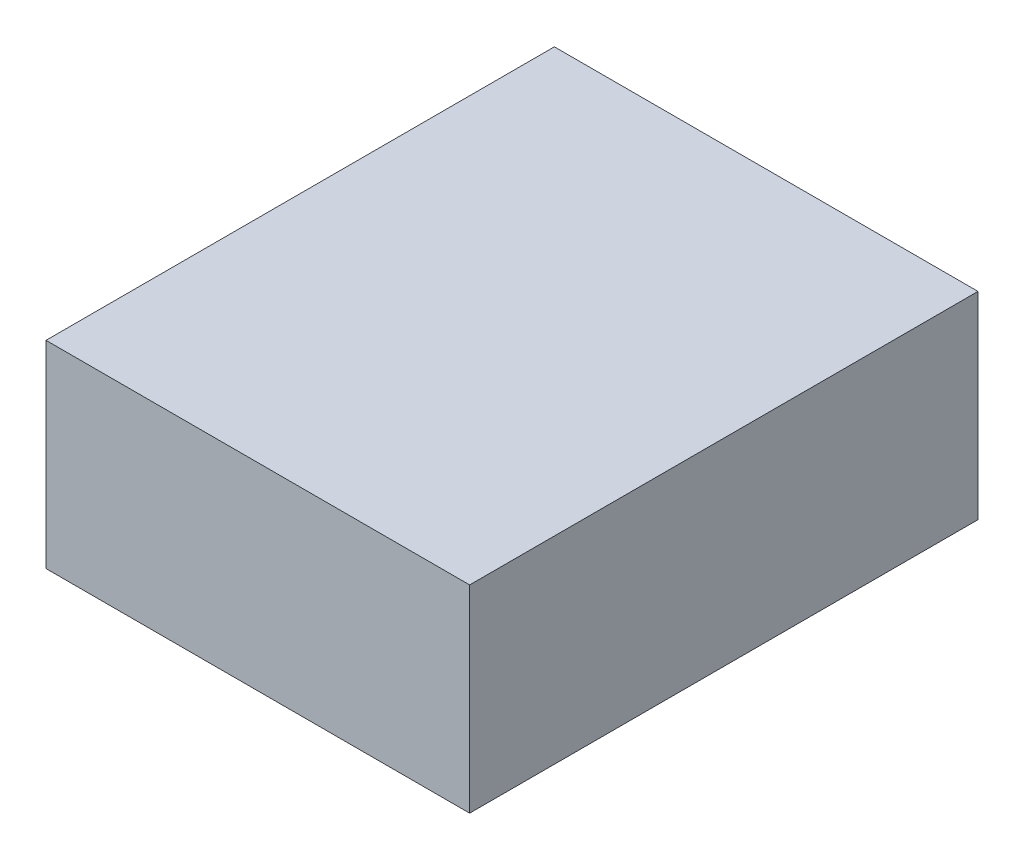
ISO-10303-21;
HEADER;
FILE_DESCRIPTION(('STEP AP214'),'2;1');
FILE_NAME('part.step','',(''),(''),'','','');
FILE_SCHEMA(('AUTOMOTIVE_DESIGN { 1 0 10303 214 1 1 1 1 }'));
ENDSEC;
DATA;
#1=APPLICATION_CONTEXT('core data for automotive mechanical design processes');
#2=APPLICATION_PROTOCOL_DEFINITION('international standard','automotive_design',2000,#1);
#3=PRODUCT_CONTEXT('',#1,'mechanical');
#4=PRODUCT('Part','Part','',(#3));
#5=PRODUCT_RELATED_PRODUCT_CATEGORY('part','',(#4));
#6=PRODUCT_DEFINITION_FORMATION('','',#4);
#7=PRODUCT_DEFINITION_CONTEXT('part definition',#1,'design');
#8=PRODUCT_DEFINITION('design','',#6,#7);
#9=PRODUCT_DEFINITION_SHAPE('','',#8);
#10=(LENGTH_UNIT() NAMED_UNIT(*) SI_UNIT(.MILLI.,.METRE.));
#11=(NAMED_UNIT(*) PLANE_ANGLE_UNIT() SI_UNIT($,.RADIAN.));
#12=(NAMED_UNIT(*) SI_UNIT($,.STERADIAN.) SOLID_ANGLE_UNIT());
#13=UNCERTAINTY_MEASURE_WITH_UNIT(LENGTH_MEASURE(1.E-05),#10,'distance_accuracy_value','');
#14=(GEOMETRIC_REPRESENTATION_CONTEXT(3) GLOBAL_UNCERTAINTY_ASSIGNED_CONTEXT((#13)) GLOBAL_UNIT_ASSIGNED_CONTEXT((#10,
#11,#12)) REPRESENTATION_CONTEXT('',''));
#15=CARTESIAN_POINT('',(0.,0.,0.));
#16=DIRECTION('',(0.,0.,1.));
#17=DIRECTION('',(1.,0.,0.));
#18=AXIS2_PLACEMENT_3D('',#15,#16,#17);
#19=CARTESIAN_POINT('',(75.,70.,-90.));
#20=DIRECTION('',(-1.,0.,0.));
#21=DIRECTION('',(0.,0.,1.));
#22=AXIS2_PLACEMENT_3D('',#19,#20,#21);
#23=PLANE('',#22);
#24=DIRECTION('',(0.,0.,-1.));
#25=VECTOR('',#24,1.);
#26=CARTESIAN_POINT('',(75.,0.,-90.));
#27=LINE('',#26,#25);
#28=CARTESIAN_POINT('',(75.,0.,90.));
#29=VERTEX_POINT('',#28);
#30=CARTESIAN_POINT('',(75.,0.,-90.));
#31=VERTEX_POINT('',#30);
#32=EDGE_CURVE('E106',#29,#31,#27,.T.);
#33=ORIENTED_EDGE('',*,*,#32,.T.);
#34=DIRECTION('',(0.,-1.,0.));
#35=VECTOR('',#34,1.);
#36=CARTESIAN_POINT('',(75.,70.,-90.));
#37=LINE('',#36,#35);
#38=CARTESIAN_POINT('',(75.,70.,-90.));
#39=VERTEX_POINT('',#38);
#40=EDGE_CURVE('E11',#39,#31,#37,.T.);
#41=ORIENTED_EDGE('',*,*,#40,.F.);
#42=DIRECTION('',(0.,0.,-1.));
#43=VECTOR('',#42,1.);
#44=CARTESIAN_POINT('',(75.,70.,-90.));
#45=LINE('',#44,#43);
#46=CARTESIAN_POINT('',(75.,70.,90.));
#47=VERTEX_POINT('',#46);
#48=EDGE_CURVE('E94',#47,#39,#45,.T.);
#49=ORIENTED_EDGE('',*,*,#48,.F.);
#50=DIRECTION('',(0.,-1.,0.));
#51=VECTOR('',#50,1.);
#52=CARTESIAN_POINT('',(75.,70.,90.));
#53=LINE('',#52,#51);
#54=EDGE_CURVE('E102',#47,#29,#53,.T.);
#55=ORIENTED_EDGE('',*,*,#54,.T.);
#56=EDGE_LOOP('',(#33,#41,#49,#55));
#57=FACE_BOUND('',#56,.T.);
#58=ADVANCED_FACE('F43',(#57),#23,.F.);
#59=CARTESIAN_POINT('',(-75.,70.,-90.));
#60=DIRECTION('',(0.,0.,1.));
#61=DIRECTION('',(1.,0.,0.));
#62=AXIS2_PLACEMENT_3D('',#59,#60,#61);
#63=PLANE('',#62);
#64=DIRECTION('',(-1.,0.,0.));
#65=VECTOR('',#64,1.);
#66=CARTESIAN_POINT('',(-75.,0.,-90.));
#67=LINE('',#66,#65);
#68=CARTESIAN_POINT('',(-75.,0.,-90.));
#69=VERTEX_POINT('',#68);
#70=EDGE_CURVE('E98',#31,#69,#67,.T.);
#71=ORIENTED_EDGE('',*,*,#70,.T.);
#72=DIRECTION('',(0.,-1.,0.));
#73=VECTOR('',#72,1.);
#74=CARTESIAN_POINT('',(-75.,70.,-90.));
#75=LINE('',#74,#73);
#76=CARTESIAN_POINT('',(-75.,70.,-90.));
#77=VERTEX_POINT('',#76);
#78=EDGE_CURVE('E51',#77,#69,#75,.T.);
#79=ORIENTED_EDGE('',*,*,#78,.F.);
#80=DIRECTION('',(-1.,0.,0.));
#81=VECTOR('',#80,1.);
#82=CARTESIAN_POINT('',(-75.,70.,-90.));
#83=LINE('',#82,#81);
#84=EDGE_CURVE('E89',#39,#77,#83,.T.);
#85=ORIENTED_EDGE('',*,*,#84,.F.);
#86=ORIENTED_EDGE('',*,*,#40,.T.);
#87=EDGE_LOOP('',(#71,#79,#85,#86));
#88=FACE_BOUND('',#87,.T.);
#89=ADVANCED_FACE('F97',(#88),#63,.F.);
#90=CARTESIAN_POINT('',(-75.,70.,-90.));
#91=DIRECTION('',(1.,0.,0.));
#92=DIRECTION('',(0.,0.,-1.));
#93=AXIS2_PLACEMENT_3D('',#90,#91,#92);
#94=PLANE('',#93);
#95=DIRECTION('',(0.,0.,1.));
#96=VECTOR('',#95,1.);
#97=CARTESIAN_POINT('',(-75.,0.,-90.));
#98=LINE('',#97,#96);
#99=CARTESIAN_POINT('',(-75.,0.,90.));
#100=VERTEX_POINT('',#99);
#101=EDGE_CURVE('E76',#69,#100,#98,.T.);
#102=ORIENTED_EDGE('',*,*,#101,.T.);
#103=DIRECTION('',(0.,-1.,0.));
#104=VECTOR('',#103,1.);
#105=CARTESIAN_POINT('',(-75.,70.,90.));
#106=LINE('',#105,#104);
#107=CARTESIAN_POINT('',(-75.,70.,90.));
#108=VERTEX_POINT('',#107);
#109=EDGE_CURVE('E99',#108,#100,#106,.T.);
#110=ORIENTED_EDGE('',*,*,#109,.F.);
#111=DIRECTION('',(0.,0.,1.));
#112=VECTOR('',#111,1.);
#113=CARTESIAN_POINT('',(-75.,70.,-90.));
#114=LINE('',#113,#112);
#115=EDGE_CURVE('E92',#77,#108,#114,.T.);
#116=ORIENTED_EDGE('',*,*,#115,.F.);
#117=ORIENTED_EDGE('',*,*,#78,.T.);
#118=EDGE_LOOP('',(#102,#110,#116,#117));
#119=FACE_BOUND('',#118,.T.);
#120=ADVANCED_FACE('F100',(#119),#94,.F.);
#121=CARTESIAN_POINT('',(-75.,70.,90.));
#122=DIRECTION('',(0.,0.,-1.));
#123=DIRECTION('',(-1.,0.,0.));
#124=AXIS2_PLACEMENT_3D('',#121,#122,#123);
#125=PLANE('',#124);
#126=DIRECTION('',(1.,0.,0.));
#127=VECTOR('',#126,1.);
#128=CARTESIAN_POINT('',(-75.,0.,90.));
#129=LINE('',#128,#127);
#130=EDGE_CURVE('E82',#100,#29,#129,.T.);
#131=ORIENTED_EDGE('',*,*,#130,.T.);
#132=ORIENTED_EDGE('',*,*,#54,.F.);
#133=DIRECTION('',(1.,0.,0.));
#134=VECTOR('',#133,1.);
#135=CARTESIAN_POINT('',(-75.,70.,90.));
#136=LINE('',#135,#134);
#137=EDGE_CURVE('E59',#108,#47,#136,.T.);
#138=ORIENTED_EDGE('',*,*,#137,.F.);
#139=ORIENTED_EDGE('',*,*,#109,.T.);
#140=EDGE_LOOP('',(#131,#132,#138,#139));
#141=FACE_BOUND('',#140,.T.);
#142=ADVANCED_FACE('F113',(#141),#125,.F.);
#143=CARTESIAN_POINT('',(0.,70.,0.));
#144=DIRECTION('',(0.,1.,0.));
#145=DIRECTION('',(0.,0.,1.));
#146=AXIS2_PLACEMENT_3D('',#143,#144,#145);
#147=PLANE('',#146);
#148=ORIENTED_EDGE('',*,*,#48,.T.);
#149=ORIENTED_EDGE('',*,*,#84,.T.);
#150=ORIENTED_EDGE('',*,*,#115,.T.);
#151=ORIENTED_EDGE('',*,*,#137,.T.);
#152=EDGE_LOOP('',(#148,#149,#150,#151));
#153=FACE_BOUND('',#152,.T.);
#154=ADVANCED_FACE('F90',(#153),#147,.T.);
#155=CARTESIAN_POINT('',(0.,0.,0.));
#156=DIRECTION('',(0.,1.,0.));
#157=DIRECTION('',(0.,0.,1.));
#158=AXIS2_PLACEMENT_3D('',#155,#156,#157);
#159=PLANE('',#158);
#160=ORIENTED_EDGE('',*,*,#32,.F.);
#161=ORIENTED_EDGE('',*,*,#130,.F.);
#162=ORIENTED_EDGE('',*,*,#101,.F.);
#163=ORIENTED_EDGE('',*,*,#70,.F.);
#164=EDGE_LOOP('',(#160,#161,#162,#163));
#165=FACE_BOUND('',#164,.T.);
#166=ADVANCED_FACE('F116',(#165),#159,.F.);
#167=CLOSED_SHELL('',(#58,#89,#120,#142,#154,#166));
#168=MANIFOLD_SOLID_BREP('B2',#167);
#169=ADVANCED_BREP_SHAPE_REPRESENTATION('',(#18,#168),#14);
#170=SHAPE_DEFINITION_REPRESENTATION(#9,#169);
ENDSEC;
END-ISO-10303-21;
